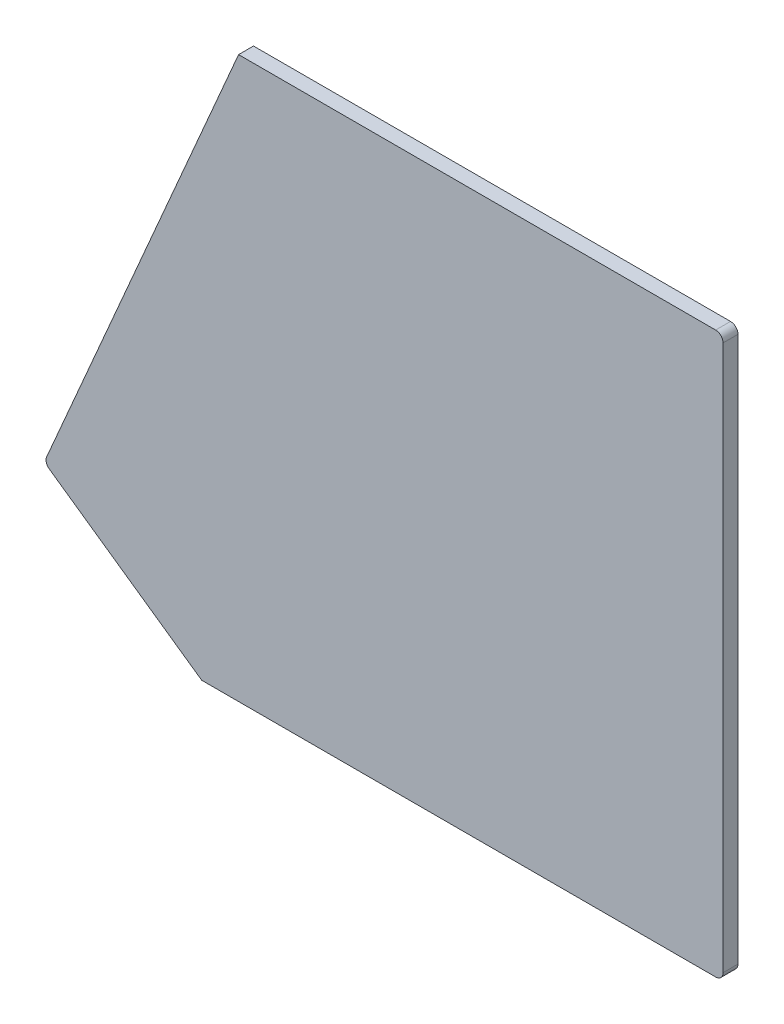
ISO-10303-21;
HEADER;
FILE_DESCRIPTION(('STEP AP214'),'2;1');
FILE_NAME('part.step','',(''),(''),'','','');
FILE_SCHEMA(('AUTOMOTIVE_DESIGN { 1 0 10303 214 1 1 1 1 }'));
ENDSEC;
DATA;
#1=APPLICATION_CONTEXT('core data for automotive mechanical design processes');
#2=APPLICATION_PROTOCOL_DEFINITION('international standard','automotive_design',2000,#1);
#3=PRODUCT_CONTEXT('',#1,'mechanical');
#4=PRODUCT('Part','Part','',(#3));
#5=PRODUCT_RELATED_PRODUCT_CATEGORY('part','',(#4));
#6=PRODUCT_DEFINITION_FORMATION('','',#4);
#7=PRODUCT_DEFINITION_CONTEXT('part definition',#1,'design');
#8=PRODUCT_DEFINITION('design','',#6,#7);
#9=PRODUCT_DEFINITION_SHAPE('','',#8);
#10=(LENGTH_UNIT() NAMED_UNIT(*) SI_UNIT(.MILLI.,.METRE.));
#11=(NAMED_UNIT(*) PLANE_ANGLE_UNIT() SI_UNIT($,.RADIAN.));
#12=(NAMED_UNIT(*) SI_UNIT($,.STERADIAN.) SOLID_ANGLE_UNIT());
#13=UNCERTAINTY_MEASURE_WITH_UNIT(LENGTH_MEASURE(1.E-05),#10,'distance_accuracy_value','');
#14=(GEOMETRIC_REPRESENTATION_CONTEXT(3) GLOBAL_UNCERTAINTY_ASSIGNED_CONTEXT((#13)) GLOBAL_UNIT_ASSIGNED_CONTEXT((#10,
#11,#12)) REPRESENTATION_CONTEXT('',''));
#15=CARTESIAN_POINT('',(0.,0.,0.));
#16=DIRECTION('',(0.,0.,1.));
#17=DIRECTION('',(1.,0.,0.));
#18=AXIS2_PLACEMENT_3D('',#15,#16,#17);
#19=CARTESIAN_POINT('',(-40.9576022144498,28.6788218175521,4.));
#20=DIRECTION('',(0.573576436351041,0.819152044288995,0.));
#21=DIRECTION('',(-0.819152044288995,0.573576436351041,0.));
#22=AXIS2_PLACEMENT_3D('',#19,#20,#21);
#23=PLANE('',#22);
#24=DIRECTION('',(0.819152044288995,-0.573576436351041,0.));
#25=VECTOR('',#24,1.);
#26=CARTESIAN_POINT('',(-40.9576022144498,28.6788218175521,0.));
#27=LINE('',#26,#25);
#28=CARTESIAN_POINT('',(-40.9576022144498,28.6788218175521,0.));
#29=VERTEX_POINT('',#28);
#30=CARTESIAN_POINT('',(0.,0.,0.));
#31=VERTEX_POINT('',#30);
#32=EDGE_CURVE('E134',#29,#31,#27,.T.);
#33=ORIENTED_EDGE('',*,*,#32,.T.);
#34=DIRECTION('',(0.,0.,-1.));
#35=VECTOR('',#34,1.);
#36=CARTESIAN_POINT('',(0.,0.,4.));
#37=LINE('',#36,#35);
#38=CARTESIAN_POINT('',(0.,0.,4.));
#39=VERTEX_POINT('',#38);
#40=EDGE_CURVE('E11',#39,#31,#37,.T.);
#41=ORIENTED_EDGE('',*,*,#40,.F.);
#42=DIRECTION('',(0.819152044288995,-0.573576436351041,0.));
#43=VECTOR('',#42,1.);
#44=CARTESIAN_POINT('',(-40.9576022144498,28.6788218175521,4.));
#45=LINE('',#44,#43);
#46=CARTESIAN_POINT('',(-40.9576022144498,28.6788218175521,4.));
#47=VERTEX_POINT('',#46);
#48=EDGE_CURVE('E146',#47,#39,#45,.T.);
#49=ORIENTED_EDGE('',*,*,#48,.F.);
#50=DIRECTION('',(0.,0.,-1.));
#51=VECTOR('',#50,1.);
#52=CARTESIAN_POINT('',(-40.9576022144498,28.6788218175521,4.));
#53=LINE('',#52,#51);
#54=EDGE_CURVE('E131',#47,#29,#53,.T.);
#55=ORIENTED_EDGE('',*,*,#54,.T.);
#56=EDGE_LOOP('',(#33,#41,#49,#55));
#57=FACE_BOUND('',#56,.T.);
#58=ADVANCED_FACE('F39',(#57),#23,.F.);
#59=CARTESIAN_POINT('',(0.,0.,4.));
#60=DIRECTION('',(0.,1.,0.));
#61=DIRECTION('',(0.,0.,1.));
#62=AXIS2_PLACEMENT_3D('',#59,#60,#61);
#63=PLANE('',#62);
#64=DIRECTION('',(1.,0.,0.));
#65=VECTOR('',#64,1.);
#66=CARTESIAN_POINT('',(0.,0.,0.));
#67=LINE('',#66,#65);
#68=CARTESIAN_POINT('',(138.,0.,0.));
#69=VERTEX_POINT('',#68);
#70=EDGE_CURVE('E138',#31,#69,#67,.T.);
#71=ORIENTED_EDGE('',*,*,#70,.T.);
#72=DIRECTION('',(0.,0.,-1.));
#73=VECTOR('',#72,1.);
#74=CARTESIAN_POINT('',(138.,0.,4.));
#75=LINE('',#74,#73);
#76=CARTESIAN_POINT('',(138.,0.,4.));
#77=VERTEX_POINT('',#76);
#78=EDGE_CURVE('E50',#77,#69,#75,.T.);
#79=ORIENTED_EDGE('',*,*,#78,.F.);
#80=DIRECTION('',(1.,0.,0.));
#81=VECTOR('',#80,1.);
#82=CARTESIAN_POINT('',(0.,0.,4.));
#83=LINE('',#82,#81);
#84=EDGE_CURVE('E97',#39,#77,#83,.T.);
#85=ORIENTED_EDGE('',*,*,#84,.F.);
#86=ORIENTED_EDGE('',*,*,#40,.T.);
#87=EDGE_LOOP('',(#71,#79,#85,#86));
#88=FACE_BOUND('',#87,.T.);
#89=ADVANCED_FACE('F182',(#88),#63,.F.);
#90=CARTESIAN_POINT('',(138.,2.,4.));
#91=DIRECTION('',(0.,0.,-1.));
#92=DIRECTION('',(-1.,0.,0.));
#93=AXIS2_PLACEMENT_3D('',#90,#91,#92);
#94=CYLINDRICAL_SURFACE('',#93,2.);
#95=CARTESIAN_POINT('',(138.,2.,0.));
#96=DIRECTION('',(0.,0.,1.));
#97=DIRECTION('',(1.,0.,0.));
#98=AXIS2_PLACEMENT_3D('',#95,#96,#97);
#99=CIRCLE('',#98,2.);
#100=CARTESIAN_POINT('',(140.,2.,0.));
#101=VERTEX_POINT('',#100);
#102=EDGE_CURVE('E139',#69,#101,#99,.T.);
#103=ORIENTED_EDGE('',*,*,#102,.T.);
#104=DIRECTION('',(0.,0.,-1.));
#105=VECTOR('',#104,1.);
#106=CARTESIAN_POINT('',(140.,2.,4.));
#107=LINE('',#106,#105);
#108=CARTESIAN_POINT('',(140.,2.,4.));
#109=VERTEX_POINT('',#108);
#110=EDGE_CURVE('E157',#109,#101,#107,.T.);
#111=ORIENTED_EDGE('',*,*,#110,.F.);
#112=CARTESIAN_POINT('',(138.,2.,4.));
#113=DIRECTION('',(0.,0.,1.));
#114=DIRECTION('',(1.,0.,0.));
#115=AXIS2_PLACEMENT_3D('',#112,#113,#114);
#116=CIRCLE('',#115,2.);
#117=EDGE_CURVE('E164',#77,#109,#116,.T.);
#118=ORIENTED_EDGE('',*,*,#117,.F.);
#119=ORIENTED_EDGE('',*,*,#78,.T.);
#120=EDGE_LOOP('',(#103,#111,#118,#119));
#121=FACE_BOUND('',#120,.T.);
#122=ADVANCED_FACE('F165',(#121),#94,.T.);
#123=CARTESIAN_POINT('',(140.,2.00000000000001,4.));
#124=DIRECTION('',(-1.,0.,0.));
#125=DIRECTION('',(0.,0.,1.));
#126=AXIS2_PLACEMENT_3D('',#123,#124,#125);
#127=PLANE('',#126);
#128=DIRECTION('',(0.,1.,0.));
#129=VECTOR('',#128,1.);
#130=CARTESIAN_POINT('',(140.,2.00000000000001,0.));
#131=LINE('',#130,#129);
#132=CARTESIAN_POINT('',(140.,148.45425632728,0.));
#133=VERTEX_POINT('',#132);
#134=EDGE_CURVE('E145',#101,#133,#131,.T.);
#135=ORIENTED_EDGE('',*,*,#134,.T.);
#136=DIRECTION('',(0.,0.,-1.));
#137=VECTOR('',#136,1.);
#138=CARTESIAN_POINT('',(140.,148.45425632728,4.));
#139=LINE('',#138,#137);
#140=CARTESIAN_POINT('',(140.,148.45425632728,4.));
#141=VERTEX_POINT('',#140);
#142=EDGE_CURVE('E153',#141,#133,#139,.T.);
#143=ORIENTED_EDGE('',*,*,#142,.F.);
#144=DIRECTION('',(0.,1.,0.));
#145=VECTOR('',#144,1.);
#146=CARTESIAN_POINT('',(140.,2.00000000000001,4.));
#147=LINE('',#146,#145);
#148=EDGE_CURVE('E176',#109,#141,#147,.T.);
#149=ORIENTED_EDGE('',*,*,#148,.F.);
#150=ORIENTED_EDGE('',*,*,#110,.T.);
#151=EDGE_LOOP('',(#135,#143,#149,#150));
#152=FACE_BOUND('',#151,.T.);
#153=ADVANCED_FACE('F175',(#152),#127,.F.);
#154=CARTESIAN_POINT('',(138.,148.45425632728,4.));
#155=DIRECTION('',(0.,0.,-1.));
#156=DIRECTION('',(-1.,0.,0.));
#157=AXIS2_PLACEMENT_3D('',#154,#155,#156);
#158=CYLINDRICAL_SURFACE('',#157,2.);
#159=CARTESIAN_POINT('',(138.,148.45425632728,0.));
#160=DIRECTION('',(0.,0.,1.));
#161=DIRECTION('',(1.,0.,0.));
#162=AXIS2_PLACEMENT_3D('',#159,#160,#161);
#163=CIRCLE('',#162,2.);
#164=CARTESIAN_POINT('',(138.,150.45425632728,0.));
#165=VERTEX_POINT('',#164);
#166=EDGE_CURVE('E143',#133,#165,#163,.T.);
#167=ORIENTED_EDGE('',*,*,#166,.T.);
#168=DIRECTION('',(0.,0.,-1.));
#169=VECTOR('',#168,1.);
#170=CARTESIAN_POINT('',(138.,150.45425632728,4.));
#171=LINE('',#170,#169);
#172=CARTESIAN_POINT('',(138.,150.45425632728,4.));
#173=VERTEX_POINT('',#172);
#174=EDGE_CURVE('E128',#173,#165,#171,.T.);
#175=ORIENTED_EDGE('',*,*,#174,.F.);
#176=CARTESIAN_POINT('',(138.,148.45425632728,4.));
#177=DIRECTION('',(0.,0.,1.));
#178=DIRECTION('',(1.,0.,0.));
#179=AXIS2_PLACEMENT_3D('',#176,#177,#178);
#180=CIRCLE('',#179,2.);
#181=EDGE_CURVE('E120',#141,#173,#180,.T.);
#182=ORIENTED_EDGE('',*,*,#181,.F.);
#183=ORIENTED_EDGE('',*,*,#142,.T.);
#184=EDGE_LOOP('',(#167,#175,#182,#183));
#185=FACE_BOUND('',#184,.T.);
#186=ADVANCED_FACE('F172',(#185),#158,.T.);
#187=CARTESIAN_POINT('',(138.,150.45425632728,4.));
#188=DIRECTION('',(0.,-1.,0.));
#189=DIRECTION('',(0.,0.,-1.));
#190=AXIS2_PLACEMENT_3D('',#187,#188,#189);
#191=PLANE('',#190);
#192=DIRECTION('',(-1.,0.,0.));
#193=VECTOR('',#192,1.);
#194=CARTESIAN_POINT('',(138.,150.45425632728,0.));
#195=LINE('',#194,#193);
#196=CARTESIAN_POINT('',(9.89940777101885,150.45425632728,0.));
#197=VERTEX_POINT('',#196);
#198=EDGE_CURVE('E124',#165,#197,#195,.T.);
#199=ORIENTED_EDGE('',*,*,#198,.T.);
#200=DIRECTION('',(0.,0.,-1.));
#201=VECTOR('',#200,1.);
#202=CARTESIAN_POINT('',(9.89940777101885,150.45425632728,4.));
#203=LINE('',#202,#201);
#204=CARTESIAN_POINT('',(9.89940777101885,150.45425632728,4.));
#205=VERTEX_POINT('',#204);
#206=EDGE_CURVE('E122',#205,#197,#203,.T.);
#207=ORIENTED_EDGE('',*,*,#206,.F.);
#208=DIRECTION('',(-1.,0.,0.));
#209=VECTOR('',#208,1.);
#210=CARTESIAN_POINT('',(138.,150.45425632728,4.));
#211=LINE('',#210,#209);
#212=EDGE_CURVE('E112',#173,#205,#211,.T.);
#213=ORIENTED_EDGE('',*,*,#212,.F.);
#214=ORIENTED_EDGE('',*,*,#174,.T.);
#215=EDGE_LOOP('',(#199,#207,#213,#214));
#216=FACE_BOUND('',#215,.T.);
#217=ADVANCED_FACE('F121',(#216),#191,.F.);
#218=CARTESIAN_POINT('',(9.89940777101885,150.45425632728,4.));
#219=DIRECTION('',(0.918031663542589,-0.396507080306552,0.));
#220=DIRECTION('',(0.396507080306552,0.918031663542589,0.));
#221=AXIS2_PLACEMENT_3D('',#218,#219,#220);
#222=PLANE('',#221);
#223=DIRECTION('',(-0.396507080306552,-0.918031663542589,0.));
#224=VECTOR('',#223,1.);
#225=CARTESIAN_POINT('',(9.89940777101885,150.45425632728,0.));
#226=LINE('',#225,#224);
#227=CARTESIAN_POINT('',(-41.6465126688329,31.1101400667432,0.));
#228=VERTEX_POINT('',#227);
#229=EDGE_CURVE('E84',#197,#228,#226,.T.);
#230=ORIENTED_EDGE('',*,*,#229,.T.);
#231=DIRECTION('',(0.,0.,-1.));
#232=VECTOR('',#231,1.);
#233=CARTESIAN_POINT('',(-41.6465126688329,31.1101400667432,4.));
#234=LINE('',#233,#232);
#235=CARTESIAN_POINT('',(-41.6465126688329,31.1101400667432,4.));
#236=VERTEX_POINT('',#235);
#237=EDGE_CURVE('E130',#236,#228,#234,.T.);
#238=ORIENTED_EDGE('',*,*,#237,.F.);
#239=DIRECTION('',(-0.396507080306552,-0.918031663542589,0.));
#240=VECTOR('',#239,1.);
#241=CARTESIAN_POINT('',(9.89940777101885,150.45425632728,4.));
#242=LINE('',#241,#240);
#243=EDGE_CURVE('E113',#205,#236,#242,.T.);
#244=ORIENTED_EDGE('',*,*,#243,.F.);
#245=ORIENTED_EDGE('',*,*,#206,.T.);
#246=EDGE_LOOP('',(#230,#238,#244,#245));
#247=FACE_BOUND('',#246,.T.);
#248=ADVANCED_FACE('F129',(#247),#222,.F.);
#249=CARTESIAN_POINT('',(-39.8104493417477,30.3171259061301,4.));
#250=DIRECTION('',(0.,0.,-1.));
#251=DIRECTION('',(-1.,0.,0.));
#252=AXIS2_PLACEMENT_3D('',#249,#250,#251);
#253=CYLINDRICAL_SURFACE('',#252,2.00000000000001);
#254=CARTESIAN_POINT('',(-39.8104493417477,30.3171259061301,0.));
#255=DIRECTION('',(0.,0.,1.));
#256=DIRECTION('',(1.,0.,0.));
#257=AXIS2_PLACEMENT_3D('',#254,#255,#256);
#258=CIRCLE('',#257,2.00000000000001);
#259=EDGE_CURVE('E89',#228,#29,#258,.T.);
#260=ORIENTED_EDGE('',*,*,#259,.T.);
#261=ORIENTED_EDGE('',*,*,#54,.F.);
#262=CARTESIAN_POINT('',(-39.8104493417477,30.3171259061301,4.));
#263=DIRECTION('',(0.,0.,1.));
#264=DIRECTION('',(1.,0.,0.));
#265=AXIS2_PLACEMENT_3D('',#262,#263,#264);
#266=CIRCLE('',#265,2.00000000000001);
#267=EDGE_CURVE('E54',#236,#47,#266,.T.);
#268=ORIENTED_EDGE('',*,*,#267,.F.);
#269=ORIENTED_EDGE('',*,*,#237,.T.);
#270=EDGE_LOOP('',(#260,#261,#268,#269));
#271=FACE_BOUND('',#270,.T.);
#272=ADVANCED_FACE('F196',(#271),#253,.T.);
#273=CARTESIAN_POINT('',(138.,2.,4.));
#274=DIRECTION('',(0.,0.,1.));
#275=DIRECTION('',(1.,0.,0.));
#276=AXIS2_PLACEMENT_3D('',#273,#274,#275);
#277=PLANE('',#276);
#278=ORIENTED_EDGE('',*,*,#48,.T.);
#279=ORIENTED_EDGE('',*,*,#84,.T.);
#280=ORIENTED_EDGE('',*,*,#117,.T.);
#281=ORIENTED_EDGE('',*,*,#148,.T.);
#282=ORIENTED_EDGE('',*,*,#181,.T.);
#283=ORIENTED_EDGE('',*,*,#212,.T.);
#284=ORIENTED_EDGE('',*,*,#243,.T.);
#285=ORIENTED_EDGE('',*,*,#267,.T.);
#286=EDGE_LOOP('',(#278,#279,#280,#281,#282,#283,#284,#285));
#287=FACE_BOUND('',#286,.T.);
#288=ADVANCED_FACE('F111',(#287),#277,.T.);
#289=CARTESIAN_POINT('',(138.,2.,0.));
#290=DIRECTION('',(0.,0.,1.));
#291=DIRECTION('',(1.,0.,0.));
#292=AXIS2_PLACEMENT_3D('',#289,#290,#291);
#293=PLANE('',#292);
#294=ORIENTED_EDGE('',*,*,#32,.F.);
#295=ORIENTED_EDGE('',*,*,#259,.F.);
#296=ORIENTED_EDGE('',*,*,#229,.F.);
#297=ORIENTED_EDGE('',*,*,#198,.F.);
#298=ORIENTED_EDGE('',*,*,#166,.F.);
#299=ORIENTED_EDGE('',*,*,#134,.F.);
#300=ORIENTED_EDGE('',*,*,#102,.F.);
#301=ORIENTED_EDGE('',*,*,#70,.F.);
#302=EDGE_LOOP('',(#294,#295,#296,#297,#298,#299,#300,#301));
#303=FACE_BOUND('',#302,.T.);
#304=ADVANCED_FACE('F166',(#303),#293,.F.);
#305=CLOSED_SHELL('',(#58,#89,#122,#153,#186,#217,#248,#272,#288,#304));
#306=MANIFOLD_SOLID_BREP('B2',#305);
#307=ADVANCED_BREP_SHAPE_REPRESENTATION('',(#18,#306),#14);
#308=SHAPE_DEFINITION_REPRESENTATION(#9,#307);
ENDSEC;
END-ISO-10303-21;
